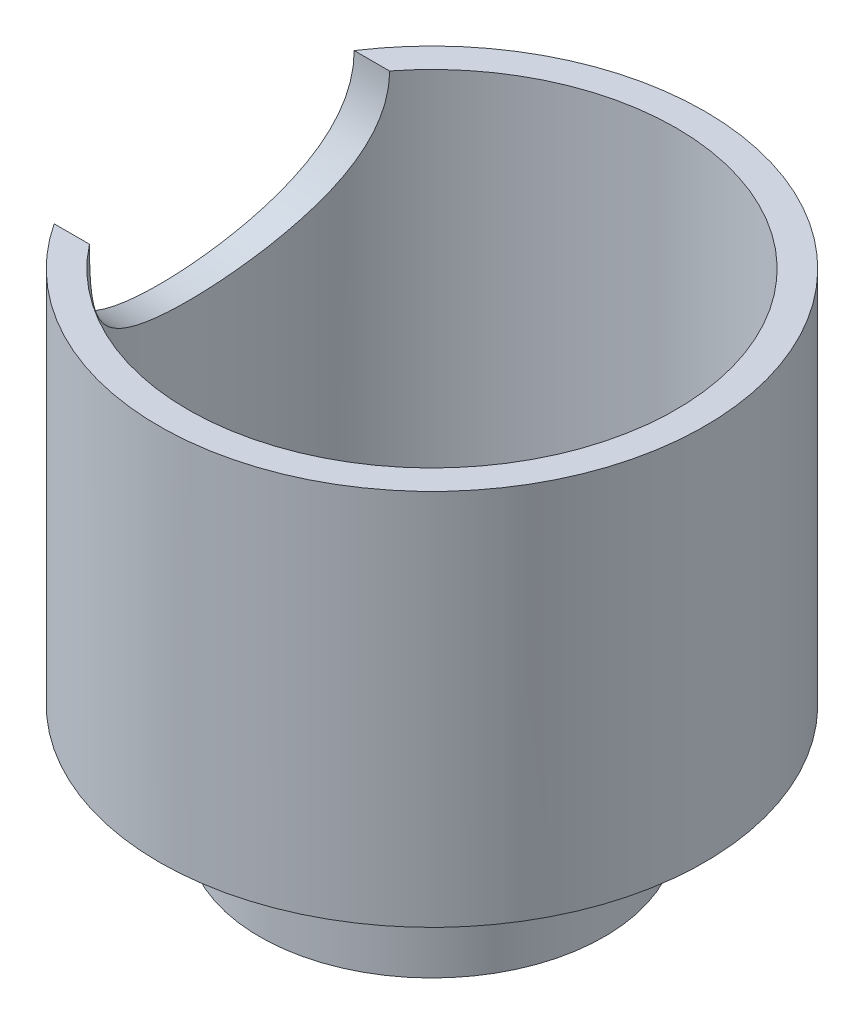
ISO-10303-21;
HEADER;
FILE_DESCRIPTION(('STEP AP214'),'2;1');
FILE_NAME('part.step','',(''),(''),'','','');
FILE_SCHEMA(('AUTOMOTIVE_DESIGN { 1 0 10303 214 1 1 1 1 }'));
ENDSEC;
DATA;
#1=APPLICATION_CONTEXT('core data for automotive mechanical design processes');
#2=APPLICATION_PROTOCOL_DEFINITION('international standard','automotive_design',2000,#1);
#3=PRODUCT_CONTEXT('',#1,'mechanical');
#4=PRODUCT('Part','Part','',(#3));
#5=PRODUCT_RELATED_PRODUCT_CATEGORY('part','',(#4));
#6=PRODUCT_DEFINITION_FORMATION('','',#4);
#7=PRODUCT_DEFINITION_CONTEXT('part definition',#1,'design');
#8=PRODUCT_DEFINITION('design','',#6,#7);
#9=PRODUCT_DEFINITION_SHAPE('','',#8);
#10=(LENGTH_UNIT() NAMED_UNIT(*) SI_UNIT(.MILLI.,.METRE.));
#11=(NAMED_UNIT(*) PLANE_ANGLE_UNIT() SI_UNIT($,.RADIAN.));
#12=(NAMED_UNIT(*) SI_UNIT($,.STERADIAN.) SOLID_ANGLE_UNIT());
#13=UNCERTAINTY_MEASURE_WITH_UNIT(LENGTH_MEASURE(1.E-05),#10,'distance_accuracy_value','');
#14=(GEOMETRIC_REPRESENTATION_CONTEXT(3) GLOBAL_UNCERTAINTY_ASSIGNED_CONTEXT((#13)) GLOBAL_UNIT_ASSIGNED_CONTEXT((#10,
#11,#12)) REPRESENTATION_CONTEXT('',''));
#15=CARTESIAN_POINT('',(0.,0.,0.));
#16=DIRECTION('',(0.,0.,1.));
#17=DIRECTION('',(1.,0.,0.));
#18=AXIS2_PLACEMENT_3D('',#15,#16,#17);
#19=CARTESIAN_POINT('',(12.,0.,0.));
#20=DIRECTION('',(0.,-1.,0.));
#21=DIRECTION('',(0.,0.,-1.));
#22=AXIS2_PLACEMENT_3D('',#19,#20,#21);
#23=PLANE('',#22);
#24=CARTESIAN_POINT('',(0.,0.,0.));
#25=DIRECTION('',(0.,-1.,0.));
#26=DIRECTION('',(0.,0.,-1.));
#27=AXIS2_PLACEMENT_3D('',#24,#25,#26);
#28=CIRCLE('',#27,12.);
#29=CARTESIAN_POINT('',(0.,0.,-12.));
#30=VERTEX_POINT('',#29);
#31=EDGE_CURVE('E103',#30,#30,#28,.T.);
#32=ORIENTED_EDGE('',*,*,#31,.T.);
#33=EDGE_LOOP('',(#32));
#34=FACE_BOUND('',#33,.T.);
#35=CARTESIAN_POINT('',(0.,0.,0.));
#36=DIRECTION('',(0.,-1.,0.));
#37=DIRECTION('',(0.,0.,-1.));
#38=AXIS2_PLACEMENT_3D('',#35,#36,#37);
#39=CIRCLE('',#38,10.);
#40=CARTESIAN_POINT('',(0.,0.,-10.));
#41=VERTEX_POINT('',#40);
#42=EDGE_CURVE('E46',#41,#41,#39,.T.);
#43=ORIENTED_EDGE('',*,*,#42,.F.);
#44=EDGE_LOOP('',(#43));
#45=FACE_BOUND('',#44,.T.);
#46=ADVANCED_FACE('F33',(#34,#45),#23,.T.);
#47=CARTESIAN_POINT('',(0.,0.,0.));
#48=DIRECTION('',(0.,-1.,0.));
#49=DIRECTION('',(0.,0.,-1.));
#50=AXIS2_PLACEMENT_3D('',#47,#48,#49);
#51=CYLINDRICAL_SURFACE('',#50,10.);
#52=ORIENTED_EDGE('',*,*,#42,.T.);
#53=EDGE_LOOP('',(#52));
#54=FACE_BOUND('',#53,.T.);
#55=CARTESIAN_POINT('',(0.,10.,0.));
#56=DIRECTION('',(0.,-1.,0.));
#57=DIRECTION('',(0.,0.,-1.));
#58=AXIS2_PLACEMENT_3D('',#55,#56,#57);
#59=CIRCLE('',#58,10.);
#60=CARTESIAN_POINT('',(0.,10.,-10.));
#61=VERTEX_POINT('',#60);
#62=EDGE_CURVE('E87',#61,#61,#59,.T.);
#63=ORIENTED_EDGE('',*,*,#62,.F.);
#64=EDGE_LOOP('',(#63));
#65=FACE_BOUND('',#64,.T.);
#66=ADVANCED_FACE('F92',(#54,#65),#51,.F.);
#67=CARTESIAN_POINT('',(10.,10.,0.));
#68=DIRECTION('',(0.,1.,0.));
#69=DIRECTION('',(0.,0.,1.));
#70=AXIS2_PLACEMENT_3D('',#67,#68,#69);
#71=PLANE('',#70);
#72=ORIENTED_EDGE('',*,*,#62,.T.);
#73=EDGE_LOOP('',(#72));
#74=FACE_BOUND('',#73,.T.);
#75=CARTESIAN_POINT('',(0.,10.,0.));
#76=DIRECTION('',(0.,-1.,0.));
#77=DIRECTION('',(0.,0.,-1.));
#78=AXIS2_PLACEMENT_3D('',#75,#76,#77);
#79=CIRCLE('',#78,17.);
#80=CARTESIAN_POINT('',(0.,10.,-17.));
#81=VERTEX_POINT('',#80);
#82=EDGE_CURVE('E78',#81,#81,#79,.T.);
#83=ORIENTED_EDGE('',*,*,#82,.F.);
#84=EDGE_LOOP('',(#83));
#85=FACE_BOUND('',#84,.T.);
#86=ADVANCED_FACE('F100',(#74,#85),#71,.T.);
#87=CARTESIAN_POINT('',(0.,0.,0.));
#88=DIRECTION('',(0.,-1.,0.));
#89=DIRECTION('',(0.,0.,-1.));
#90=AXIS2_PLACEMENT_3D('',#87,#88,#89);
#91=CYLINDRICAL_SURFACE('',#90,17.);
#92=CARTESIAN_POINT('',(-13.4088590118623,34.3,10.45));
#93=CARTESIAN_POINT('',(-13.4088541572394,34.1686337794725,10.4500016789845));
#94=CARTESIAN_POINT('',(-13.4107904105973,34.0372882052657,10.4475222672895));
#95=CARTESIAN_POINT('',(-13.4184965470656,33.7749055694247,10.4376246403045));
#96=CARTESIAN_POINT('',(-13.4242661415876,33.6438684853114,10.4302067967983));
#97=CARTESIAN_POINT('',(-13.4472327477521,33.2519283260879,10.400605590222));
#98=CARTESIAN_POINT('',(-13.4700878319086,32.9918562018527,10.3710744194583));
#99=CARTESIAN_POINT('',(-13.5296315402958,32.4784713776937,10.2932705861211));
#100=CARTESIAN_POINT('',(-13.5662025535829,32.2251202835521,10.2451571605142));
#101=CARTESIAN_POINT('',(-13.6517151181135,31.7246063490174,10.1309307273382));
#102=CARTESIAN_POINT('',(-13.7006593634209,31.4774448692065,10.0648137995665));
#103=CARTESIAN_POINT('',(-13.8089183449436,30.9917422628029,9.9157551274329));
#104=CARTESIAN_POINT('',(-13.8681904649574,30.7531703929349,9.83288230639036));
#105=CARTESIAN_POINT('',(-13.9953298109086,30.2847027797343,9.65106590346023));
#106=CARTESIAN_POINT('',(-14.0631967439348,30.0548067410757,9.55212286921314));
#107=CARTESIAN_POINT('',(-14.2772046451817,29.378166891187,9.23185957800874));
#108=CARTESIAN_POINT('',(-14.4335609359013,28.9452815737382,8.98735726104967));
#109=CARTESIAN_POINT('',(-14.6878355359943,28.3016215815086,8.56152102231486));
#110=CARTESIAN_POINT('',(-14.7815453362588,28.0762261865592,8.39905671873859));
#111=CARTESIAN_POINT('',(-14.9707063775197,27.6394235374984,8.05705211526095));
#112=CARTESIAN_POINT('',(-15.0661577390966,27.4280172566763,7.87751062933237));
#113=CARTESIAN_POINT('',(-15.2566163813905,27.0199288153027,7.50200073041894));
#114=CARTESIAN_POINT('',(-15.3516234149375,26.8232541047137,7.30602411072884));
#115=CARTESIAN_POINT('',(-15.5390437858373,26.4456232971896,6.89843574862988));
#116=CARTESIAN_POINT('',(-15.6314579241248,26.2646623093462,6.68682890936301));
#117=CARTESIAN_POINT('',(-15.8221938533834,25.8993252754255,6.22318813172866));
#118=CARTESIAN_POINT('',(-15.9199580569214,25.7169864808142,5.9693116694122));
#119=CARTESIAN_POINT('',(-16.1071562760401,25.3745569197055,5.44401157593135));
#120=CARTESIAN_POINT('',(-16.1965894806942,25.2144683182625,5.17258624093414));
#121=CARTESIAN_POINT('',(-16.3645087120849,24.918395588823,4.61387811632684));
#122=CARTESIAN_POINT('',(-16.4430020093315,24.7823954355431,4.32660603717115));
#123=CARTESIAN_POINT('',(-16.5867100642199,24.5362176937304,3.73801548887644));
#124=CARTESIAN_POINT('',(-16.6519271397829,24.4260355970649,3.43669948300293));
#125=CARTESIAN_POINT('',(-16.7612603522348,24.2428038855092,2.85296304022828));
#126=CARTESIAN_POINT('',(-16.8068270356898,24.167156653719,2.57162886042507));
#127=CARTESIAN_POINT('',(-16.8841770592588,24.0393699558824,2.00179907478319));
#128=CARTESIAN_POINT('',(-16.9159612276458,23.9872290771925,1.71330390039305));
#129=CARTESIAN_POINT('',(-16.9647777371909,23.9073495843409,1.13196010348985));
#130=CARTESIAN_POINT('',(-16.9818223868577,23.8795906093133,0.839115321493701));
#131=CARTESIAN_POINT('',(-17.0006764963493,23.8488921879124,0.251650308829443));
#132=CARTESIAN_POINT('',(-17.0024876231158,23.8459500259374,-0.0429697240494765));
#133=CARTESIAN_POINT('',(-16.9915893232121,23.8636868022256,-0.592782921886364));
#134=CARTESIAN_POINT('',(-16.9807388347227,23.8813416709022,-0.848117536596135));
#135=CARTESIAN_POINT('',(-16.9477389571389,23.935212867093,-1.35605911944277));
#136=CARTESIAN_POINT('',(-16.9255907935466,23.971427181395,-1.60866638039184));
#137=CARTESIAN_POINT('',(-16.870501610569,24.0619527320886,-2.10941622031665));
#138=CARTESIAN_POINT('',(-16.8375601911404,24.1162646392537,-2.3575586334468));
#139=CARTESIAN_POINT('',(-16.7616111458558,24.2423343585281,-2.84779298464469));
#140=CARTESIAN_POINT('',(-16.7186030996189,24.314092899211,-3.08988466956758));
#141=CARTESIAN_POINT('',(-16.6232502846652,24.4745672383424,-3.56750323884861));
#142=CARTESIAN_POINT('',(-16.5708716307036,24.5633446654061,-3.8030025857644));
#143=CARTESIAN_POINT('',(-16.4579160849065,24.7568519652036,-4.26540382756849));
#144=CARTESIAN_POINT('',(-16.3973362837594,24.8615875006499,-4.49230263473467));
#145=CARTESIAN_POINT('',(-16.2691566174627,25.0860732790475,-4.93638983107259));
#146=CARTESIAN_POINT('',(-16.201558553746,25.2058196706719,-5.15358069168548));
#147=CARTESIAN_POINT('',(-16.0605206469045,25.4595279951062,-5.57760030877382));
#148=CARTESIAN_POINT('',(-15.9870787148415,25.5934950169632,-5.78442531644257));
#149=CARTESIAN_POINT('',(-15.8263786899815,25.8919999155316,-6.21159968858565));
#150=CARTESIAN_POINT('',(-15.7385287542204,26.0582731499004,-6.43051507990368));
#151=CARTESIAN_POINT('',(-15.5589277981068,26.4066474686888,-6.85365645458797));
#152=CARTESIAN_POINT('',(-15.4671764912054,26.5887497167513,-7.05788135598755));
#153=CARTESIAN_POINT('',(-15.2815370133693,26.9681993204549,-7.45130945292394));
#154=CARTESIAN_POINT('',(-15.1876455826355,27.1655712051773,-7.6404874454889));
#155=CARTESIAN_POINT('',(-14.9998836905459,27.5745253456817,-8.00282027319439));
#156=CARTESIAN_POINT('',(-14.9060132301989,27.7861081793385,-8.17597445606017));
#157=CARTESIAN_POINT('',(-14.7087608914549,28.2502353099754,-8.52629228374866));
#158=CARTESIAN_POINT('',(-14.605664251382,28.5045874092517,-8.70123066437342));
#159=CARTESIAN_POINT('',(-14.4054289768934,29.0295402667141,-9.02887000394669));
#160=CARTESIAN_POINT('',(-14.3082913154328,29.3001436641402,-9.18156733704142));
#161=CARTESIAN_POINT('',(-14.1238132069251,29.8555687262275,-9.4628804341553));
#162=CARTESIAN_POINT('',(-14.0364407570738,30.1403392452473,-9.59157584425559));
#163=CARTESIAN_POINT('',(-13.8748183284782,30.7234870355837,-9.82392353738528));
#164=CARTESIAN_POINT('',(-13.8005639513059,31.0218597037887,-9.92758421873631));
#165=CARTESIAN_POINT('',(-13.6834415964154,31.5627535593275,-10.0881609343868));
#166=CARTESIAN_POINT('',(-13.6372647011029,31.8030028219605,-10.150345126634));
#167=CARTESIAN_POINT('',(-13.5566816989895,32.2891461560396,-10.2577238457191));
#168=CARTESIAN_POINT('',(-13.5222714049955,32.5350381861752,-10.3029244168148));
#169=CARTESIAN_POINT('',(-13.4663088771022,33.032888530347,-10.3759666287514));
#170=CARTESIAN_POINT('',(-13.4448596672739,33.2848793069361,-10.4036692599731));
#171=CARTESIAN_POINT('',(-13.4233106521757,33.664544671883,-10.4314356690218));
#172=CARTESIAN_POINT('',(-13.4178983904864,33.7914639387983,-10.4383932457931));
#173=CARTESIAN_POINT('',(-13.4106703006094,34.0455825850287,-10.4476763220687));
#174=CARTESIAN_POINT('',(-13.408854722263,34.1727819831885,-10.4500014997864));
#175=CARTESIAN_POINT('',(-13.4088590118623,34.3,-10.45));
#176=B_SPLINE_CURVE_WITH_KNOTS('',3,(#92,#93,#94,#95,#96,#97,#98,#99,#100,#101,#102,#103,#104,
#105,#106,#107,#108,#109,#110,#111,#112,#113,#114,#115,#116,#117,#118,#119,#120,#121,#122,#123,
#124,#125,#126,#127,#128,#129,#130,#131,#132,#133,#134,#135,#136,#137,#138,#139,#140,#141,#142,
#143,#144,#145,#146,#147,#148,#149,#150,#151,#152,#153,#154,#155,#156,#157,#158,#159,#160,#161,
#162,#163,#164,#165,#166,#167,#168,#169,#170,#171,#172,#173,#174,#175),.UNSPECIFIED.,.F.,.F.,(4,
2,2,2,2,2,2,2,2,2,2,2,2,2,2,2,2,2,2,2,2,2,2,2,2,2,2,2,2,2,2,2,2,2,2,2,2,2,2,2,2,4),(0.,
0.39402052027217,0.788011380548571,1.57497685216363,2.35534307528147,3.13587935661562,
3.91326803027607,4.69063021765164,6.24793899173511,7.12696615499735,8.00605441220541,
8.88558427651731,9.76483939782744,10.7460513373218,11.7273586868751,12.7080107313461,
13.6884914147566,14.5718150911893,15.4550856761081,16.3376179552878,17.2200536613366,
17.9876550034102,18.7551730985337,19.5227196443004,20.2902982484089,21.0607107784408,
21.8313973277269,22.6018865455762,23.3726524290886,24.2375676876565,25.1025465828596,
25.9689450406774,26.835378751129,27.8105769014045,28.785933856149,29.7579943221836,
30.7297282397746,31.4861697211284,32.2423417388797,33.0044478925344,33.3860046963116,
33.7675880037605),.UNSPECIFIED.);
#177=CARTESIAN_POINT('',(-13.4088590118623,34.3,10.45));
#178=VERTEX_POINT('',#177);
#179=CARTESIAN_POINT('',(-13.4088590118623,34.3,-10.45));
#180=VERTEX_POINT('',#179);
#181=EDGE_CURVE('E56',#178,#180,#176,.T.);
#182=ORIENTED_EDGE('',*,*,#181,.F.);
#183=CARTESIAN_POINT('',(0.,34.3,0.));
#184=DIRECTION('',(0.,-1.,0.));
#185=DIRECTION('',(0.,0.,-1.));
#186=AXIS2_PLACEMENT_3D('',#183,#184,#185);
#187=CIRCLE('',#186,17.);
#188=EDGE_CURVE('E72',#180,#178,#187,.T.);
#189=ORIENTED_EDGE('',*,*,#188,.F.);
#190=EDGE_LOOP('',(#182,#189));
#191=FACE_BOUND('',#190,.T.);
#192=ORIENTED_EDGE('',*,*,#82,.T.);
#193=EDGE_LOOP('',(#192));
#194=FACE_BOUND('',#193,.T.);
#195=ADVANCED_FACE('F114',(#191,#194),#91,.F.);
#196=CARTESIAN_POINT('',(17.,34.3,0.));
#197=DIRECTION('',(0.,1.,0.));
#198=DIRECTION('',(0.,0.,1.));
#199=AXIS2_PLACEMENT_3D('',#196,#197,#198);
#200=PLANE('',#199);
#201=DIRECTION('',(1.,0.,0.));
#202=VECTOR('',#201,1.);
#203=CARTESIAN_POINT('',(-19.,34.3,10.45));
#204=LINE('',#203,#202);
#205=CARTESIAN_POINT('',(-15.8681284340656,34.3,10.45));
#206=VERTEX_POINT('',#205);
#207=EDGE_CURVE('E52',#206,#178,#204,.T.);
#208=ORIENTED_EDGE('',*,*,#207,.F.);
#209=CARTESIAN_POINT('',(0.,34.3,0.));
#210=DIRECTION('',(0.,-1.,0.));
#211=DIRECTION('',(0.,0.,-1.));
#212=AXIS2_PLACEMENT_3D('',#209,#210,#211);
#213=CIRCLE('',#212,19.);
#214=CARTESIAN_POINT('',(-15.8681284340656,34.3,-10.45));
#215=VERTEX_POINT('',#214);
#216=EDGE_CURVE('E70',#215,#206,#213,.T.);
#217=ORIENTED_EDGE('',*,*,#216,.F.);
#218=DIRECTION('',(1.,0.,0.));
#219=VECTOR('',#218,1.);
#220=CARTESIAN_POINT('',(-19.,34.3,-10.45));
#221=LINE('',#220,#219);
#222=EDGE_CURVE('E63',#180,#215,#221,.F.);
#223=ORIENTED_EDGE('',*,*,#222,.F.);
#224=ORIENTED_EDGE('',*,*,#188,.T.);
#225=EDGE_LOOP('',(#208,#217,#223,#224));
#226=FACE_BOUND('',#225,.T.);
#227=ADVANCED_FACE('F69',(#226),#200,.T.);
#228=CARTESIAN_POINT('',(0.,0.,0.));
#229=DIRECTION('',(0.,-1.,0.));
#230=DIRECTION('',(0.,0.,-1.));
#231=AXIS2_PLACEMENT_3D('',#228,#229,#230);
#232=CYLINDRICAL_SURFACE('',#231,19.);
#233=CARTESIAN_POINT('',(-15.8681284340656,34.3,-10.45));
#234=CARTESIAN_POINT('',(-15.8681246559729,34.1653833149891,-10.4500012730181));
#235=CARTESIAN_POINT('',(-15.8698422115779,34.0307864478376,-10.4473981935161));
#236=CARTESIAN_POINT('',(-15.8766816326083,33.7618869862102,-10.4370032538798));
#237=CARTESIAN_POINT('',(-15.8818033136192,33.6275843761886,-10.4292116748264));
#238=CARTESIAN_POINT('',(-15.9022035166576,33.2257493900968,-10.3981046596639));
#239=CARTESIAN_POINT('',(-15.9225173529007,32.9590162589393,-10.3670568574151));
#240=CARTESIAN_POINT('',(-15.9755820898262,32.4318171395036,-10.2850919997626));
#241=CARTESIAN_POINT('',(-16.0082474732981,32.1713208671769,-10.2343115002847));
#242=CARTESIAN_POINT('',(-16.0848045161732,31.6564693719258,-10.1135634255716));
#243=CARTESIAN_POINT('',(-16.1286978876201,31.4021150920111,-10.0435929241274));
#244=CARTESIAN_POINT('',(-16.2260552771701,30.9018502283056,-9.88553018246523));
#245=CARTESIAN_POINT('',(-16.2794912687168,30.6559173660677,-9.79749089995467));
#246=CARTESIAN_POINT('',(-16.3943606685431,30.1729436946844,-9.60403995683278));
#247=CARTESIAN_POINT('',(-16.4557939147708,29.9359027054843,-9.49862864822693));
#248=CARTESIAN_POINT('',(-16.5850592272797,29.4712752819912,-9.27108162313205));
#249=CARTESIAN_POINT('',(-16.6529023479392,29.2437061932698,-9.14891684383235));
#250=CARTESIAN_POINT('',(-16.7931891214218,28.7992566003047,-8.88879269546811));
#251=CARTESIAN_POINT('',(-16.8656332267182,28.582377151046,-8.75083177189294));
#252=CARTESIAN_POINT('',(-17.0208707913538,28.1388371524624,-8.44524660649842));
#253=CARTESIAN_POINT('',(-17.1039735239912,27.913377165401,-8.27603504615457));
#254=CARTESIAN_POINT('',(-17.2716010378501,27.4771517454434,-7.92025692286623));
#255=CARTESIAN_POINT('',(-17.356125903044,27.2663871840702,-7.73368933213889));
#256=CARTESIAN_POINT('',(-17.5245996758007,26.8603610419234,-7.34394254747332));
#257=CARTESIAN_POINT('',(-17.6085483013791,26.6651066169124,-7.14075577283886));
#258=CARTESIAN_POINT('',(-17.7738481776533,26.2912371415642,-6.71875429802652));
#259=CARTESIAN_POINT('',(-17.8552002696029,26.1126166652579,-6.49994473541626));
#260=CARTESIAN_POINT('',(-18.0203050555937,25.7583052928639,-6.02796580951805));
#261=CARTESIAN_POINT('',(-18.1036579714908,25.5842006174535,-5.77346113451382));
#262=CARTESIAN_POINT('',(-18.262821138262,25.2582431644075,-5.2482990315859));
#263=CARTESIAN_POINT('',(-18.3386308383007,25.1063920114297,-4.97764042634378));
#264=CARTESIAN_POINT('',(-18.4804871163755,24.8265930463403,-4.42196345972371));
#265=CARTESIAN_POINT('',(-18.5465391496878,24.6986318672827,-4.13695324241697));
#266=CARTESIAN_POINT('',(-18.6669279387466,24.4680942773136,-3.55446192453809));
#267=CARTESIAN_POINT('',(-18.7212662542732,24.3655144863877,-3.25698249065589));
#268=CARTESIAN_POINT('',(-18.8125395654125,24.1946097581584,-2.67716156036429));
#269=CARTESIAN_POINT('',(-18.8505461022332,24.1241454583119,-2.39561869371008));
#270=CARTESIAN_POINT('',(-18.9141925377618,24.0067196174583,-1.82629028871862));
#271=CARTESIAN_POINT('',(-18.9398330637093,23.9597568843797,-1.53850506778544));
#272=CARTESIAN_POINT('',(-18.9779834579204,23.8900428826343,-0.959332065107874));
#273=CARTESIAN_POINT('',(-18.9905014956532,23.8672765502572,-0.667946639160723));
#274=CARTESIAN_POINT('',(-19.0020572982258,23.8462559718408,-0.0840349414601877));
#275=CARTESIAN_POINT('',(-19.0010961304523,23.8479997849005,0.208491238125637));
#276=CARTESIAN_POINT('',(-18.986537018077,23.8744937192387,0.76138192815084));
#277=CARTESIAN_POINT('',(-18.97427465686,23.896812366127,1.0219025811858));
#278=CARTESIAN_POINT('',(-18.9392788647418,23.9607784045931,1.53982717952238));
#279=CARTESIAN_POINT('',(-18.9165463323066,24.0024241376779,1.79723139030732));
#280=CARTESIAN_POINT('',(-18.8611432232997,24.1045568521245,2.30717744119804));
#281=CARTESIAN_POINT('',(-18.8284724601834,24.1650441871515,2.55971918993879));
#282=CARTESIAN_POINT('',(-18.7539343956568,24.3042006089911,3.0583494215066));
#283=CARTESIAN_POINT('',(-18.7120667370384,24.3828704020179,3.3044376532629));
#284=CARTESIAN_POINT('',(-18.6195639348382,24.5585271755928,3.79129051288054));
#285=CARTESIAN_POINT('',(-18.5688413468723,24.6556978168595,4.03197210941065));
#286=CARTESIAN_POINT('',(-18.4599953673567,24.8669661949012,4.50414244029669));
#287=CARTESIAN_POINT('',(-18.4018693218507,24.981070004232,4.73562783881111));
#288=CARTESIAN_POINT('',(-18.279417775016,25.2252674186986,5.18824121521788));
#289=CARTESIAN_POINT('',(-18.215093025991,25.3553590839996,5.4093704451548));
#290=CARTESIAN_POINT('',(-18.0814707607809,25.6307105559795,5.8404943223379));
#291=CARTESIAN_POINT('',(-18.0121714613699,25.7759758105097,6.05048492934414));
#292=CARTESIAN_POINT('',(-17.8622736907849,26.0972185556614,6.48046570029447));
#293=CARTESIAN_POINT('',(-17.781261737982,26.2748188398789,6.69910080414365));
#294=CARTESIAN_POINT('',(-17.6166222801085,26.646527105727,7.12080538383843));
#295=CARTESIAN_POINT('',(-17.5329945827455,26.8406363027964,7.32387371151187));
#296=CARTESIAN_POINT('',(-17.3649587686544,27.2446419237716,7.71384060763867));
#297=CARTESIAN_POINT('',(-17.2805498467567,27.4545567252083,7.90071979251648));
#298=CARTESIAN_POINT('',(-17.1130738002932,27.8890731994456,8.2572086769888));
#299=CARTESIAN_POINT('',(-17.0300066892155,28.1136750197678,8.42681820307707));
#300=CARTESIAN_POINT('',(-16.8600984974949,28.5972712232828,8.76216156562717));
#301=CARTESIAN_POINT('',(-16.773577332291,28.8575485702563,8.92621372321556));
#302=CARTESIAN_POINT('',(-16.6074766862903,29.393308113382,9.23157338358674));
#303=CARTESIAN_POINT('',(-16.5278982240262,29.6687925308484,9.37287755167582));
#304=CARTESIAN_POINT('',(-16.3788369713242,30.2327465828359,9.63098465736375));
#305=CARTESIAN_POINT('',(-16.3093285822235,30.5211807604486,9.74785006769433));
#306=CARTESIAN_POINT('',(-16.1830919535635,31.1097882905724,9.95602284359848));
#307=CARTESIAN_POINT('',(-16.1263584421653,31.409956740435,10.0473407557039));
#308=CARTESIAN_POINT('',(-16.0437477570263,31.9236751008197,10.1785121378221));
#309=CARTESIAN_POINT('',(-16.0137780908027,32.1347704625161,10.2255185262193));
#310=CARTESIAN_POINT('',(-15.9618037153635,32.5603823158968,10.3064606327971));
#311=CARTESIAN_POINT('',(-15.9397967212684,32.7748978077028,10.3404001006948));
#312=CARTESIAN_POINT('',(-15.9042551230562,33.2071568553254,10.3949890356453));
#313=CARTESIAN_POINT('',(-15.8907533975621,33.4249096474307,10.4155869370567));
#314=CARTESIAN_POINT('',(-15.8726660496449,33.8617680737177,10.443108726044));
#315=CARTESIAN_POINT('',(-15.8680855119231,34.0808744080409,10.4500248155989));
#316=CARTESIAN_POINT('',(-15.8681284340656,34.3,10.45));
#317=B_SPLINE_CURVE_WITH_KNOTS('',3,(#233,#234,#235,#236,#237,#238,#239,#240,#241,#242,#243,
#244,#245,#246,#247,#248,#249,#250,#251,#252,#253,#254,#255,#256,#257,#258,#259,#260,#261,#262,
#263,#264,#265,#266,#267,#268,#269,#270,#271,#272,#273,#274,#275,#276,#277,#278,#279,#280,#281,
#282,#283,#284,#285,#286,#287,#288,#289,#290,#291,#292,#293,#294,#295,#296,#297,#298,#299,#300,
#301,#302,#303,#304,#305,#306,#307,#308,#309,#310,#311,#312,#313,#314,#315,#316),.UNSPECIFIED.,
.F.,.F.,(4,2,2,2,2,2,2,2,2,2,2,2,2,2,2,2,2,2,2,2,2,2,2,2,2,2,2,2,2,2,2,2,2,2,2,2,2,2,2,2,2,4),
(0.,0.403774900877862,0.807527929500474,1.61421634347208,2.4154189043595,3.21674370550549,
4.01575261388323,4.81474533411241,5.61514205241605,6.41561760618316,7.29637563173929,
8.17718584693272,9.05840010095439,9.93932588987509,10.896356113444,11.853456171935,
12.8100190971677,13.7664545692164,14.6433457334633,15.5201924145922,16.3964928857487,
17.2727239651172,18.0570787544756,18.8413662493439,19.6256684665201,20.4100011514402,
21.202569498715,21.9954227660016,22.7881799298052,23.5812227060215,24.4595921876933,
25.338026393811,26.2174982342825,27.0969789098323,28.0545593291095,29.0122799953022,
29.9675216788514,30.92236843516,31.5768566276699,32.2311568663348,32.8879711427837,
33.5451596662769),.UNSPECIFIED.);
#318=EDGE_CURVE('E11',#215,#206,#317,.T.);
#319=ORIENTED_EDGE('',*,*,#318,.F.);
#320=ORIENTED_EDGE('',*,*,#216,.T.);
#321=EDGE_LOOP('',(#319,#320));
#322=FACE_BOUND('',#321,.T.);
#323=CARTESIAN_POINT('',(0.,8.,0.));
#324=DIRECTION('',(0.,-1.,0.));
#325=DIRECTION('',(0.,0.,-1.));
#326=AXIS2_PLACEMENT_3D('',#323,#324,#325);
#327=CIRCLE('',#326,19.);
#328=CARTESIAN_POINT('',(0.,8.,-19.));
#329=VERTEX_POINT('',#328);
#330=EDGE_CURVE('E76',#329,#329,#327,.T.);
#331=ORIENTED_EDGE('',*,*,#330,.F.);
#332=EDGE_LOOP('',(#331));
#333=FACE_BOUND('',#332,.T.);
#334=ADVANCED_FACE('F74',(#322,#333),#232,.T.);
#335=CARTESIAN_POINT('',(19.,8.,0.));
#336=DIRECTION('',(0.,-1.,0.));
#337=DIRECTION('',(0.,0.,-1.));
#338=AXIS2_PLACEMENT_3D('',#335,#336,#337);
#339=PLANE('',#338);
#340=ORIENTED_EDGE('',*,*,#330,.T.);
#341=EDGE_LOOP('',(#340));
#342=FACE_BOUND('',#341,.T.);
#343=CARTESIAN_POINT('',(0.,8.,0.));
#344=DIRECTION('',(0.,-1.,0.));
#345=DIRECTION('',(0.,0.,-1.));
#346=AXIS2_PLACEMENT_3D('',#343,#344,#345);
#347=CIRCLE('',#346,12.);
#348=CARTESIAN_POINT('',(0.,8.,-12.));
#349=VERTEX_POINT('',#348);
#350=EDGE_CURVE('E81',#349,#349,#347,.T.);
#351=ORIENTED_EDGE('',*,*,#350,.F.);
#352=EDGE_LOOP('',(#351));
#353=FACE_BOUND('',#352,.T.);
#354=ADVANCED_FACE('F125',(#342,#353),#339,.T.);
#355=CARTESIAN_POINT('',(0.,0.,0.));
#356=DIRECTION('',(0.,-1.,0.));
#357=DIRECTION('',(0.,0.,-1.));
#358=AXIS2_PLACEMENT_3D('',#355,#356,#357);
#359=CYLINDRICAL_SURFACE('',#358,12.);
#360=ORIENTED_EDGE('',*,*,#350,.T.);
#361=EDGE_LOOP('',(#360));
#362=FACE_BOUND('',#361,.T.);
#363=ORIENTED_EDGE('',*,*,#31,.F.);
#364=EDGE_LOOP('',(#363));
#365=FACE_BOUND('',#364,.T.);
#366=ADVANCED_FACE('F121',(#362,#365),#359,.T.);
#367=CARTESIAN_POINT('',(-19.,34.3,0.));
#368=DIRECTION('',(1.,0.,0.));
#369=DIRECTION('',(0.,0.,-1.));
#370=AXIS2_PLACEMENT_3D('',#367,#368,#369);
#371=CYLINDRICAL_SURFACE('',#370,10.45);
#372=ORIENTED_EDGE('',*,*,#181,.T.);
#373=ORIENTED_EDGE('',*,*,#222,.T.);
#374=ORIENTED_EDGE('',*,*,#318,.T.);
#375=ORIENTED_EDGE('',*,*,#207,.T.);
#376=EDGE_LOOP('',(#372,#373,#374,#375));
#377=FACE_BOUND('',#376,.T.);
#378=ADVANCED_FACE('F62',(#377),#371,.F.);
#379=CLOSED_SHELL('',(#46,#66,#86,#195,#227,#334,#354,#366,#378));
#380=MANIFOLD_SOLID_BREP('B2',#379);
#381=ADVANCED_BREP_SHAPE_REPRESENTATION('',(#18,#380),#14);
#382=SHAPE_DEFINITION_REPRESENTATION(#9,#381);
ENDSEC;
END-ISO-10303-21;
